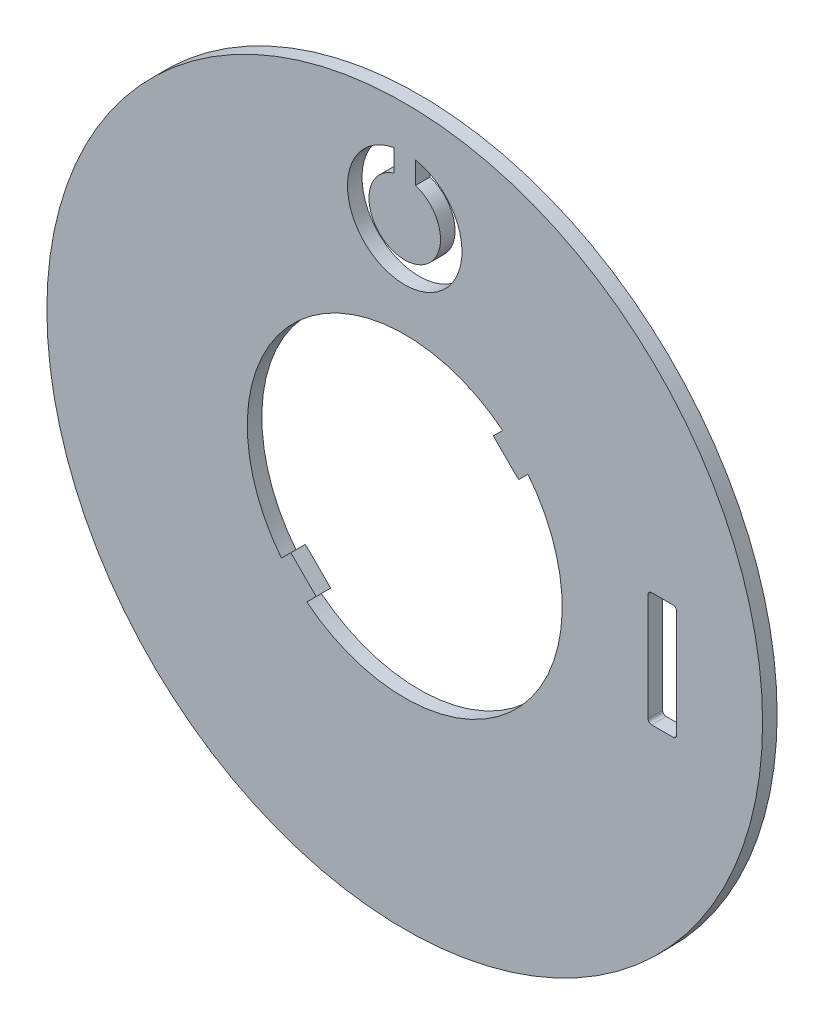
ISO-10303-21;
HEADER;
FILE_DESCRIPTION(('STEP AP214'),'2;1');
FILE_NAME('part.step','',(''),(''),'','','');
FILE_SCHEMA(('AUTOMOTIVE_DESIGN { 1 0 10303 214 1 1 1 1 }'));
ENDSEC;
DATA;
#1=APPLICATION_CONTEXT('core data for automotive mechanical design processes');
#2=APPLICATION_PROTOCOL_DEFINITION('international standard','automotive_design',2000,#1);
#3=PRODUCT_CONTEXT('',#1,'mechanical');
#4=PRODUCT('Part','Part','',(#3));
#5=PRODUCT_RELATED_PRODUCT_CATEGORY('part','',(#4));
#6=PRODUCT_DEFINITION_FORMATION('','',#4);
#7=PRODUCT_DEFINITION_CONTEXT('part definition',#1,'design');
#8=PRODUCT_DEFINITION('design','',#6,#7);
#9=PRODUCT_DEFINITION_SHAPE('','',#8);
#10=(LENGTH_UNIT() NAMED_UNIT(*) SI_UNIT(.MILLI.,.METRE.));
#11=(NAMED_UNIT(*) PLANE_ANGLE_UNIT() SI_UNIT($,.RADIAN.));
#12=(NAMED_UNIT(*) SI_UNIT($,.STERADIAN.) SOLID_ANGLE_UNIT());
#13=UNCERTAINTY_MEASURE_WITH_UNIT(LENGTH_MEASURE(1.E-05),#10,'distance_accuracy_value','');
#14=(GEOMETRIC_REPRESENTATION_CONTEXT(3) GLOBAL_UNCERTAINTY_ASSIGNED_CONTEXT((#13)) GLOBAL_UNIT_ASSIGNED_CONTEXT((#10,
#11,#12)) REPRESENTATION_CONTEXT('',''));
#15=CARTESIAN_POINT('',(0.,0.,0.));
#16=DIRECTION('',(0.,0.,1.));
#17=DIRECTION('',(1.,0.,0.));
#18=AXIS2_PLACEMENT_3D('',#15,#16,#17);
#19=CARTESIAN_POINT('',(107.000000000666,61.8,1.016));
#20=DIRECTION('',(0.,0.,-1.));
#21=DIRECTION('',(-1.,0.,0.));
#22=AXIS2_PLACEMENT_3D('',#19,#20,#21);
#23=CYLINDRICAL_SURFACE('',#22,25.);
#24=CARTESIAN_POINT('',(107.000000000666,61.8,1.016));
#25=DIRECTION('',(0.,0.,1.));
#26=DIRECTION('',(1.,0.,0.));
#27=AXIS2_PLACEMENT_3D('',#24,#25,#26);
#28=CIRCLE('',#27,25.);
#29=CARTESIAN_POINT('',(132.000000000666,61.8,1.016));
#30=VERTEX_POINT('',#29);
#31=EDGE_CURVE('E310',#30,#30,#28,.T.);
#32=ORIENTED_EDGE('',*,*,#31,.F.);
#33=EDGE_LOOP('',(#32));
#34=FACE_BOUND('',#33,.T.);
#35=CARTESIAN_POINT('',(107.000000000666,61.8,0.));
#36=DIRECTION('',(0.,0.,1.));
#37=DIRECTION('',(1.,0.,0.));
#38=AXIS2_PLACEMENT_3D('',#35,#36,#37);
#39=CIRCLE('',#38,25.);
#40=CARTESIAN_POINT('',(132.000000000666,61.8,0.));
#41=VERTEX_POINT('',#40);
#42=EDGE_CURVE('E309',#41,#41,#39,.T.);
#43=ORIENTED_EDGE('',*,*,#42,.T.);
#44=EDGE_LOOP('',(#43));
#45=FACE_BOUND('',#44,.T.);
#46=ADVANCED_FACE('F68',(#34,#45),#23,.T.);
#47=CARTESIAN_POINT('',(107.000000000666,61.8,1.016));
#48=DIRECTION('',(0.,0.,-1.));
#49=DIRECTION('',(-1.,0.,0.));
#50=AXIS2_PLACEMENT_3D('',#47,#48,#49);
#51=CYLINDRICAL_SURFACE('',#50,11.);
#52=CARTESIAN_POINT('',(107.000000000666,61.8,0.));
#53=DIRECTION('',(0.,0.,1.));
#54=DIRECTION('',(1.,0.,0.));
#55=AXIS2_PLACEMENT_3D('',#52,#53,#54);
#56=CIRCLE('',#55,11.);
#57=CARTESIAN_POINT('',(100.156092719112,53.18832576548,0.));
#58=VERTEX_POINT('',#57);
#59=CARTESIAN_POINT('',(115.611674235186,68.6439072815537,0.));
#60=VERTEX_POINT('',#59);
#61=EDGE_CURVE('E317',#58,#60,#56,.T.);
#62=ORIENTED_EDGE('',*,*,#61,.F.);
#63=DIRECTION('',(0.,0.,-1.));
#64=VECTOR('',#63,1.);
#65=CARTESIAN_POINT('',(100.156092719112,53.18832576548,1.016));
#66=LINE('',#65,#64);
#67=CARTESIAN_POINT('',(100.156092719112,53.18832576548,1.016));
#68=VERTEX_POINT('',#67);
#69=EDGE_CURVE('E322',#68,#58,#66,.T.);
#70=ORIENTED_EDGE('',*,*,#69,.F.);
#71=CARTESIAN_POINT('',(107.000000000666,61.8,1.016));
#72=DIRECTION('',(0.,0.,1.));
#73=DIRECTION('',(1.,0.,0.));
#74=AXIS2_PLACEMENT_3D('',#71,#72,#73);
#75=CIRCLE('',#74,11.);
#76=CARTESIAN_POINT('',(115.611674235186,68.6439072815537,1.016));
#77=VERTEX_POINT('',#76);
#78=EDGE_CURVE('E308',#68,#77,#75,.T.);
#79=ORIENTED_EDGE('',*,*,#78,.T.);
#80=DIRECTION('',(0.,0.,-1.));
#81=VECTOR('',#80,1.);
#82=CARTESIAN_POINT('',(115.611674235186,68.6439072815537,1.016));
#83=LINE('',#82,#81);
#84=EDGE_CURVE('E77',#77,#60,#83,.T.);
#85=ORIENTED_EDGE('',*,*,#84,.T.);
#86=EDGE_LOOP('',(#62,#70,#79,#85));
#87=FACE_BOUND('',#86,.T.);
#88=ADVANCED_FACE('F400',(#87),#51,.F.);
#89=CARTESIAN_POINT('',(113.84390728222,70.41167423452,0.));
#90=VERTEX_POINT('',#89);
#91=CARTESIAN_POINT('',(98.3883257661459,54.9560927184463,0.));
#92=VERTEX_POINT('',#91);
#93=EDGE_CURVE('E314',#90,#92,#56,.T.);
#94=ORIENTED_EDGE('',*,*,#93,.F.);
#95=DIRECTION('',(0.,0.,-1.));
#96=VECTOR('',#95,1.);
#97=CARTESIAN_POINT('',(113.84390728222,70.41167423452,1.016));
#98=LINE('',#97,#96);
#99=CARTESIAN_POINT('',(113.84390728222,70.41167423452,1.016));
#100=VERTEX_POINT('',#99);
#101=EDGE_CURVE('E12',#100,#90,#98,.T.);
#102=ORIENTED_EDGE('',*,*,#101,.F.);
#103=CARTESIAN_POINT('',(98.3883257661459,54.9560927184463,1.016));
#104=VERTEX_POINT('',#103);
#105=EDGE_CURVE('E305',#100,#104,#75,.T.);
#106=ORIENTED_EDGE('',*,*,#105,.T.);
#107=DIRECTION('',(0.,0.,-1.));
#108=VECTOR('',#107,1.);
#109=CARTESIAN_POINT('',(98.3883257661459,54.9560927184463,1.016));
#110=LINE('',#109,#108);
#111=EDGE_CURVE('E313',#104,#92,#110,.T.);
#112=ORIENTED_EDGE('',*,*,#111,.T.);
#113=EDGE_LOOP('',(#94,#102,#106,#112));
#114=FACE_BOUND('',#113,.T.);
#115=ADVANCED_FACE('F384',(#114),#51,.F.);
#116=CARTESIAN_POINT('',(0.,0.,0.));
#117=DIRECTION('',(0.,0.,1.));
#118=DIRECTION('',(1.,0.,0.));
#119=AXIS2_PLACEMENT_3D('',#116,#117,#118);
#120=PLANE('',#119);
#121=DIRECTION('',(0.,-1.,0.));
#122=VECTOR('',#121,1.);
#123=CARTESIAN_POINT('',(107.750000000666,0.,0.));
#124=LINE('',#123,#122);
#125=CARTESIAN_POINT('',(107.750000000666,83.7290584113754,0.));
#126=VERTEX_POINT('',#125);
#127=CARTESIAN_POINT('',(107.750000000666,82.1848480035423,0.));
#128=VERTEX_POINT('',#127);
#129=EDGE_CURVE('E223',#126,#128,#124,.T.);
#130=ORIENTED_EDGE('',*,*,#129,.T.);
#131=CARTESIAN_POINT('',(107.000000000666,79.8,0.));
#132=DIRECTION('',(0.,0.,1.));
#133=DIRECTION('',(1.,0.,0.));
#134=AXIS2_PLACEMENT_3D('',#131,#132,#133);
#135=CIRCLE('',#134,2.49999999999996);
#136=CARTESIAN_POINT('',(106.250000000666,82.1848480035423,0.));
#137=VERTEX_POINT('',#136);
#138=EDGE_CURVE('E85',#137,#128,#135,.T.);
#139=ORIENTED_EDGE('',*,*,#138,.F.);
#140=DIRECTION('',(0.,1.,0.));
#141=VECTOR('',#140,1.);
#142=CARTESIAN_POINT('',(106.250000000666,0.,0.));
#143=LINE('',#142,#141);
#144=CARTESIAN_POINT('',(106.250000000666,83.7290584113754,0.));
#145=VERTEX_POINT('',#144);
#146=EDGE_CURVE('E213',#137,#145,#143,.T.);
#147=ORIENTED_EDGE('',*,*,#146,.T.);
#148=CARTESIAN_POINT('',(107.000000000666,79.8,0.));
#149=DIRECTION('',(0.,0.,1.));
#150=DIRECTION('',(1.,0.,0.));
#151=AXIS2_PLACEMENT_3D('',#148,#149,#150);
#152=CIRCLE('',#151,3.99999999999996);
#153=EDGE_CURVE('E238',#145,#126,#152,.T.);
#154=ORIENTED_EDGE('',*,*,#153,.T.);
#155=EDGE_LOOP('',(#130,#139,#147,#154));
#156=FACE_BOUND('',#155,.T.);
#157=DIRECTION('',(1.,0.,0.));
#158=VECTOR('',#157,1.);
#159=CARTESIAN_POINT('',(0.,65.8,0.));
#160=LINE('',#159,#158);
#161=CARTESIAN_POINT('',(124.250000000666,65.8,0.));
#162=VERTEX_POINT('',#161);
#163=CARTESIAN_POINT('',(125.750000000666,65.8,0.));
#164=VERTEX_POINT('',#163);
#165=EDGE_CURVE('E251',#162,#164,#160,.T.);
#166=ORIENTED_EDGE('',*,*,#165,.F.);
#167=CARTESIAN_POINT('',(124.250000000666,65.55,0.));
#168=DIRECTION('',(0.,0.,1.));
#169=DIRECTION('',(1.,0.,0.));
#170=AXIS2_PLACEMENT_3D('',#167,#168,#169);
#171=CIRCLE('',#170,0.25);
#172=CARTESIAN_POINT('',(124.000000000666,65.55,0.));
#173=VERTEX_POINT('',#172);
#174=EDGE_CURVE('E93',#173,#162,#171,.F.);
#175=ORIENTED_EDGE('',*,*,#174,.F.);
#176=DIRECTION('',(0.,1.,0.));
#177=VECTOR('',#176,1.);
#178=CARTESIAN_POINT('',(124.000000000666,0.,0.));
#179=LINE('',#178,#177);
#180=CARTESIAN_POINT('',(124.000000000666,58.05,0.));
#181=VERTEX_POINT('',#180);
#182=EDGE_CURVE('E271',#181,#173,#179,.T.);
#183=ORIENTED_EDGE('',*,*,#182,.F.);
#184=CARTESIAN_POINT('',(124.250000000666,58.05,0.));
#185=DIRECTION('',(0.,0.,1.));
#186=DIRECTION('',(1.,0.,0.));
#187=AXIS2_PLACEMENT_3D('',#184,#185,#186);
#188=CIRCLE('',#187,0.25);
#189=CARTESIAN_POINT('',(124.250000000666,57.8,0.));
#190=VERTEX_POINT('',#189);
#191=EDGE_CURVE('E274',#190,#181,#188,.F.);
#192=ORIENTED_EDGE('',*,*,#191,.F.);
#193=DIRECTION('',(1.,0.,0.));
#194=VECTOR('',#193,1.);
#195=CARTESIAN_POINT('',(0.,57.8,0.));
#196=LINE('',#195,#194);
#197=CARTESIAN_POINT('',(125.750000000666,57.8,0.));
#198=VERTEX_POINT('',#197);
#199=EDGE_CURVE('E277',#190,#198,#196,.T.);
#200=ORIENTED_EDGE('',*,*,#199,.T.);
#201=CARTESIAN_POINT('',(125.750000000666,58.05,0.));
#202=DIRECTION('',(0.,0.,1.));
#203=DIRECTION('',(1.,0.,0.));
#204=AXIS2_PLACEMENT_3D('',#201,#202,#203);
#205=CIRCLE('',#204,0.250000000000014);
#206=CARTESIAN_POINT('',(126.000000000666,58.05,0.));
#207=VERTEX_POINT('',#206);
#208=EDGE_CURVE('E280',#198,#207,#205,.T.);
#209=ORIENTED_EDGE('',*,*,#208,.T.);
#210=DIRECTION('',(0.,1.,0.));
#211=VECTOR('',#210,1.);
#212=CARTESIAN_POINT('',(126.000000000666,0.,0.));
#213=LINE('',#212,#211);
#214=CARTESIAN_POINT('',(126.000000000666,65.55,0.));
#215=VERTEX_POINT('',#214);
#216=EDGE_CURVE('E283',#207,#215,#213,.T.);
#217=ORIENTED_EDGE('',*,*,#216,.T.);
#218=CARTESIAN_POINT('',(125.750000000666,65.55,0.));
#219=DIRECTION('',(0.,0.,1.));
#220=DIRECTION('',(1.,0.,0.));
#221=AXIS2_PLACEMENT_3D('',#218,#219,#220);
#222=CIRCLE('',#221,0.250000000000014);
#223=EDGE_CURVE('E286',#164,#215,#222,.F.);
#224=ORIENTED_EDGE('',*,*,#223,.F.);
#225=EDGE_LOOP('',(#166,#175,#183,#192,#200,#209,#217,#224));
#226=FACE_BOUND('',#225,.T.);
#227=DIRECTION('',(-0.707106781186547,-0.707106781186547,0.));
#228=VECTOR('',#227,1.);
#229=CARTESIAN_POINT('',(113.894291117235,70.4620580695352,0.));
#230=LINE('',#229,#228);
#231=CARTESIAN_POINT('',(113.187184336048,69.7549512883487,0.));
#232=VERTEX_POINT('',#231);
#233=EDGE_CURVE('E337',#90,#232,#230,.T.);
#234=ORIENTED_EDGE('',*,*,#233,.F.);
#235=ORIENTED_EDGE('',*,*,#93,.T.);
#236=DIRECTION('',(-0.707106781186534,-0.707106781186561,0.));
#237=VECTOR('',#236,1.);
#238=CARTESIAN_POINT('',(99.0450487123172,55.6128156646177,0.));
#239=LINE('',#238,#237);
#240=CARTESIAN_POINT('',(99.0450487123172,55.6128156646177,0.));
#241=VERTEX_POINT('',#240);
#242=EDGE_CURVE('E347',#241,#92,#239,.T.);
#243=ORIENTED_EDGE('',*,*,#242,.F.);
#244=DIRECTION('',(-0.707106781186549,0.707106781186546,0.));
#245=VECTOR('',#244,1.);
#246=CARTESIAN_POINT('',(100.812815665284,53.8450487116514,0.));
#247=LINE('',#246,#245);
#248=CARTESIAN_POINT('',(100.812815665284,53.8450487116514,0.));
#249=VERTEX_POINT('',#248);
#250=EDGE_CURVE('E354',#249,#241,#247,.T.);
#251=ORIENTED_EDGE('',*,*,#250,.F.);
#252=DIRECTION('',(0.707106781186547,0.707106781186547,0.));
#253=VECTOR('',#252,1.);
#254=CARTESIAN_POINT('',(100.105708884097,53.1379419304648,0.));
#255=LINE('',#254,#253);
#256=EDGE_CURVE('E214',#58,#249,#255,.T.);
#257=ORIENTED_EDGE('',*,*,#256,.F.);
#258=ORIENTED_EDGE('',*,*,#61,.T.);
#259=DIRECTION('',(0.707106781186547,0.707106781186547,0.));
#260=VECTOR('',#259,1.);
#261=CARTESIAN_POINT('',(114.954951289015,67.9871843353823,0.));
#262=LINE('',#261,#260);
#263=CARTESIAN_POINT('',(114.954951289015,67.9871843353823,0.));
#264=VERTEX_POINT('',#263);
#265=EDGE_CURVE('E334',#264,#60,#262,.T.);
#266=ORIENTED_EDGE('',*,*,#265,.F.);
#267=DIRECTION('',(0.707106781186547,-0.707106781186547,0.));
#268=VECTOR('',#267,1.);
#269=CARTESIAN_POINT('',(113.187184336048,69.7549512883487,0.));
#270=LINE('',#269,#268);
#271=EDGE_CURVE('E329',#232,#264,#270,.T.);
#272=ORIENTED_EDGE('',*,*,#271,.F.);
#273=EDGE_LOOP('',(#234,#235,#243,#251,#257,#258,#266,#272));
#274=FACE_BOUND('',#273,.T.);
#275=ORIENTED_EDGE('',*,*,#42,.F.);
#276=EDGE_LOOP('',(#275));
#277=FACE_BOUND('',#276,.T.);
#278=ADVANCED_FACE('F376',(#156,#226,#274,#277),#120,.F.);
#279=CARTESIAN_POINT('',(0.,0.,1.016));
#280=DIRECTION('',(0.,0.,1.));
#281=DIRECTION('',(1.,0.,0.));
#282=AXIS2_PLACEMENT_3D('',#279,#280,#281);
#283=PLANE('',#282);
#284=CARTESIAN_POINT('',(107.000000000666,79.8,1.016));
#285=DIRECTION('',(0.,0.,1.));
#286=DIRECTION('',(1.,0.,0.));
#287=AXIS2_PLACEMENT_3D('',#284,#285,#286);
#288=CIRCLE('',#287,2.49999999999996);
#289=CARTESIAN_POINT('',(106.250000000666,82.1848480035423,1.016));
#290=VERTEX_POINT('',#289);
#291=CARTESIAN_POINT('',(107.750000000666,82.1848480035423,1.016));
#292=VERTEX_POINT('',#291);
#293=EDGE_CURVE('E218',#290,#292,#288,.T.);
#294=ORIENTED_EDGE('',*,*,#293,.T.);
#295=DIRECTION('',(0.,-1.,0.));
#296=VECTOR('',#295,1.);
#297=CARTESIAN_POINT('',(107.750000000666,0.,1.016));
#298=LINE('',#297,#296);
#299=CARTESIAN_POINT('',(107.750000000666,83.7290584113754,1.016));
#300=VERTEX_POINT('',#299);
#301=EDGE_CURVE('E231',#300,#292,#298,.T.);
#302=ORIENTED_EDGE('',*,*,#301,.F.);
#303=CARTESIAN_POINT('',(107.000000000666,79.8,1.016));
#304=DIRECTION('',(0.,0.,1.));
#305=DIRECTION('',(1.,0.,0.));
#306=AXIS2_PLACEMENT_3D('',#303,#304,#305);
#307=CIRCLE('',#306,3.99999999999996);
#308=CARTESIAN_POINT('',(106.250000000666,83.7290584113754,1.016));
#309=VERTEX_POINT('',#308);
#310=EDGE_CURVE('E229',#309,#300,#307,.T.);
#311=ORIENTED_EDGE('',*,*,#310,.F.);
#312=DIRECTION('',(0.,1.,0.));
#313=VECTOR('',#312,1.);
#314=CARTESIAN_POINT('',(106.250000000666,0.,1.016));
#315=LINE('',#314,#313);
#316=EDGE_CURVE('E210',#290,#309,#315,.T.);
#317=ORIENTED_EDGE('',*,*,#316,.F.);
#318=EDGE_LOOP('',(#294,#302,#311,#317));
#319=FACE_BOUND('',#318,.T.);
#320=CARTESIAN_POINT('',(124.250000000666,65.55,1.016));
#321=DIRECTION('',(0.,0.,1.));
#322=DIRECTION('',(1.,0.,0.));
#323=AXIS2_PLACEMENT_3D('',#320,#321,#322);
#324=CIRCLE('',#323,0.25);
#325=CARTESIAN_POINT('',(124.000000000666,65.55,1.016));
#326=VERTEX_POINT('',#325);
#327=CARTESIAN_POINT('',(124.250000000666,65.8,1.016));
#328=VERTEX_POINT('',#327);
#329=EDGE_CURVE('E247',#326,#328,#324,.F.);
#330=ORIENTED_EDGE('',*,*,#329,.T.);
#331=DIRECTION('',(1.,0.,0.));
#332=VECTOR('',#331,1.);
#333=CARTESIAN_POINT('',(0.,65.8,1.016));
#334=LINE('',#333,#332);
#335=CARTESIAN_POINT('',(125.750000000666,65.8,1.016));
#336=VERTEX_POINT('',#335);
#337=EDGE_CURVE('E266',#328,#336,#334,.T.);
#338=ORIENTED_EDGE('',*,*,#337,.T.);
#339=CARTESIAN_POINT('',(125.750000000666,65.55,1.016));
#340=DIRECTION('',(0.,0.,1.));
#341=DIRECTION('',(1.,0.,0.));
#342=AXIS2_PLACEMENT_3D('',#339,#340,#341);
#343=CIRCLE('',#342,0.250000000000014);
#344=CARTESIAN_POINT('',(126.000000000666,65.55,1.016));
#345=VERTEX_POINT('',#344);
#346=EDGE_CURVE('E263',#336,#345,#343,.F.);
#347=ORIENTED_EDGE('',*,*,#346,.T.);
#348=DIRECTION('',(0.,1.,0.));
#349=VECTOR('',#348,1.);
#350=CARTESIAN_POINT('',(126.000000000666,0.,1.016));
#351=LINE('',#350,#349);
#352=CARTESIAN_POINT('',(126.000000000666,58.05,1.016));
#353=VERTEX_POINT('',#352);
#354=EDGE_CURVE('E261',#353,#345,#351,.T.);
#355=ORIENTED_EDGE('',*,*,#354,.F.);
#356=CARTESIAN_POINT('',(125.750000000666,58.05,1.016));
#357=DIRECTION('',(0.,0.,1.));
#358=DIRECTION('',(1.,0.,0.));
#359=AXIS2_PLACEMENT_3D('',#356,#357,#358);
#360=CIRCLE('',#359,0.250000000000014);
#361=CARTESIAN_POINT('',(125.750000000666,57.8,1.016));
#362=VERTEX_POINT('',#361);
#363=EDGE_CURVE('E259',#362,#353,#360,.T.);
#364=ORIENTED_EDGE('',*,*,#363,.F.);
#365=DIRECTION('',(1.,0.,0.));
#366=VECTOR('',#365,1.);
#367=CARTESIAN_POINT('',(0.,57.8,1.016));
#368=LINE('',#367,#366);
#369=CARTESIAN_POINT('',(124.250000000666,57.8,1.016));
#370=VERTEX_POINT('',#369);
#371=EDGE_CURVE('E257',#370,#362,#368,.T.);
#372=ORIENTED_EDGE('',*,*,#371,.F.);
#373=CARTESIAN_POINT('',(124.250000000666,58.05,1.016));
#374=DIRECTION('',(0.,0.,1.));
#375=DIRECTION('',(1.,0.,0.));
#376=AXIS2_PLACEMENT_3D('',#373,#374,#375);
#377=CIRCLE('',#376,0.25);
#378=CARTESIAN_POINT('',(124.000000000666,58.05,1.016));
#379=VERTEX_POINT('',#378);
#380=EDGE_CURVE('E254',#370,#379,#377,.F.);
#381=ORIENTED_EDGE('',*,*,#380,.T.);
#382=DIRECTION('',(0.,1.,0.));
#383=VECTOR('',#382,1.);
#384=CARTESIAN_POINT('',(124.000000000666,0.,1.016));
#385=LINE('',#384,#383);
#386=EDGE_CURVE('E250',#379,#326,#385,.T.);
#387=ORIENTED_EDGE('',*,*,#386,.T.);
#388=EDGE_LOOP('',(#330,#338,#347,#355,#364,#372,#381,#387));
#389=FACE_BOUND('',#388,.T.);
#390=ORIENTED_EDGE('',*,*,#105,.F.);
#391=DIRECTION('',(-0.707106781186547,-0.707106781186547,0.));
#392=VECTOR('',#391,1.);
#393=CARTESIAN_POINT('',(113.894291117235,70.4620580695352,1.016));
#394=LINE('',#393,#392);
#395=CARTESIAN_POINT('',(113.187184336048,69.7549512883487,1.016));
#396=VERTEX_POINT('',#395);
#397=EDGE_CURVE('E328',#100,#396,#394,.T.);
#398=ORIENTED_EDGE('',*,*,#397,.T.);
#399=DIRECTION('',(0.707106781186547,-0.707106781186547,0.));
#400=VECTOR('',#399,1.);
#401=CARTESIAN_POINT('',(113.187184336048,69.7549512883487,1.016));
#402=LINE('',#401,#400);
#403=CARTESIAN_POINT('',(114.954951289015,67.9871843353823,1.016));
#404=VERTEX_POINT('',#403);
#405=EDGE_CURVE('E331',#396,#404,#402,.T.);
#406=ORIENTED_EDGE('',*,*,#405,.T.);
#407=DIRECTION('',(0.707106781186547,0.707106781186547,0.));
#408=VECTOR('',#407,1.);
#409=CARTESIAN_POINT('',(114.954951289015,67.9871843353823,1.016));
#410=LINE('',#409,#408);
#411=EDGE_CURVE('E325',#404,#77,#410,.T.);
#412=ORIENTED_EDGE('',*,*,#411,.T.);
#413=ORIENTED_EDGE('',*,*,#78,.F.);
#414=DIRECTION('',(0.707106781186547,0.707106781186547,0.));
#415=VECTOR('',#414,1.);
#416=CARTESIAN_POINT('',(100.105708884097,53.1379419304648,1.016));
#417=LINE('',#416,#415);
#418=CARTESIAN_POINT('',(100.812815665284,53.8450487116514,1.016));
#419=VERTEX_POINT('',#418);
#420=EDGE_CURVE('E344',#68,#419,#417,.T.);
#421=ORIENTED_EDGE('',*,*,#420,.T.);
#422=DIRECTION('',(-0.707106781186549,0.707106781186546,0.));
#423=VECTOR('',#422,1.);
#424=CARTESIAN_POINT('',(100.812815665284,53.8450487116514,1.016));
#425=LINE('',#424,#423);
#426=CARTESIAN_POINT('',(99.0450487123172,55.6128156646177,1.016));
#427=VERTEX_POINT('',#426);
#428=EDGE_CURVE('E346',#419,#427,#425,.T.);
#429=ORIENTED_EDGE('',*,*,#428,.T.);
#430=DIRECTION('',(-0.707106781186534,-0.707106781186561,0.));
#431=VECTOR('',#430,1.);
#432=CARTESIAN_POINT('',(99.0450487123172,55.6128156646177,1.016));
#433=LINE('',#432,#431);
#434=EDGE_CURVE('E349',#427,#104,#433,.T.);
#435=ORIENTED_EDGE('',*,*,#434,.T.);
#436=EDGE_LOOP('',(#390,#398,#406,#412,#413,#421,#429,#435));
#437=FACE_BOUND('',#436,.T.);
#438=ORIENTED_EDGE('',*,*,#31,.T.);
#439=EDGE_LOOP('',(#438));
#440=FACE_BOUND('',#439,.T.);
#441=ADVANCED_FACE('F226',(#319,#389,#437,#440),#283,.T.);
#442=CARTESIAN_POINT('',(100.105708884097,53.1379419304648,1.016));
#443=DIRECTION('',(-0.707106781186548,0.707106781186548,0.));
#444=DIRECTION('',(-0.707106781186548,-0.707106781186548,0.));
#445=AXIS2_PLACEMENT_3D('',#442,#443,#444);
#446=PLANE('',#445);
#447=ORIENTED_EDGE('',*,*,#420,.F.);
#448=ORIENTED_EDGE('',*,*,#69,.T.);
#449=ORIENTED_EDGE('',*,*,#256,.T.);
#450=DIRECTION('',(0.,0.,-1.));
#451=VECTOR('',#450,1.);
#452=CARTESIAN_POINT('',(100.812815665284,53.8450487116514,1.016));
#453=LINE('',#452,#451);
#454=EDGE_CURVE('E72',#419,#249,#453,.T.);
#455=ORIENTED_EDGE('',*,*,#454,.F.);
#456=EDGE_LOOP('',(#447,#448,#449,#455));
#457=FACE_BOUND('',#456,.T.);
#458=ADVANCED_FACE('F70',(#457),#446,.F.);
#459=CARTESIAN_POINT('',(100.812815665284,53.8450487116514,1.016));
#460=DIRECTION('',(-0.707106781186546,-0.707106781186549,0.));
#461=DIRECTION('',(0.707106781186549,-0.707106781186546,0.));
#462=AXIS2_PLACEMENT_3D('',#459,#460,#461);
#463=PLANE('',#462);
#464=ORIENTED_EDGE('',*,*,#250,.T.);
#465=DIRECTION('',(0.,0.,-1.));
#466=VECTOR('',#465,1.);
#467=CARTESIAN_POINT('',(99.0450487123172,55.6128156646177,1.016));
#468=LINE('',#467,#466);
#469=EDGE_CURVE('E352',#427,#241,#468,.T.);
#470=ORIENTED_EDGE('',*,*,#469,.F.);
#471=ORIENTED_EDGE('',*,*,#428,.F.);
#472=ORIENTED_EDGE('',*,*,#454,.T.);
#473=EDGE_LOOP('',(#464,#470,#471,#472));
#474=FACE_BOUND('',#473,.T.);
#475=ADVANCED_FACE('F366',(#474),#463,.F.);
#476=CARTESIAN_POINT('',(99.0450487123172,55.6128156646177,1.016));
#477=DIRECTION('',(0.707106781186561,-0.707106781186534,0.));
#478=DIRECTION('',(0.707106781186534,0.707106781186561,0.));
#479=AXIS2_PLACEMENT_3D('',#476,#477,#478);
#480=PLANE('',#479);
#481=ORIENTED_EDGE('',*,*,#111,.F.);
#482=ORIENTED_EDGE('',*,*,#434,.F.);
#483=ORIENTED_EDGE('',*,*,#469,.T.);
#484=ORIENTED_EDGE('',*,*,#242,.T.);
#485=EDGE_LOOP('',(#481,#482,#483,#484));
#486=FACE_BOUND('',#485,.T.);
#487=ADVANCED_FACE('F379',(#486),#480,.F.);
#488=CARTESIAN_POINT('',(113.894291117235,70.4620580695352,1.016));
#489=DIRECTION('',(0.707106781186548,-0.707106781186548,0.));
#490=DIRECTION('',(0.707106781186548,0.707106781186548,0.));
#491=AXIS2_PLACEMENT_3D('',#488,#489,#490);
#492=PLANE('',#491);
#493=ORIENTED_EDGE('',*,*,#397,.F.);
#494=ORIENTED_EDGE('',*,*,#101,.T.);
#495=ORIENTED_EDGE('',*,*,#233,.T.);
#496=DIRECTION('',(0.,0.,-1.));
#497=VECTOR('',#496,1.);
#498=CARTESIAN_POINT('',(113.187184336048,69.7549512883487,1.016));
#499=LINE('',#498,#497);
#500=EDGE_CURVE('E318',#396,#232,#499,.T.);
#501=ORIENTED_EDGE('',*,*,#500,.F.);
#502=EDGE_LOOP('',(#493,#494,#495,#501));
#503=FACE_BOUND('',#502,.T.);
#504=ADVANCED_FACE('F388',(#503),#492,.F.);
#505=CARTESIAN_POINT('',(113.187184336048,69.7549512883487,1.016));
#506=DIRECTION('',(0.707106781186548,0.707106781186548,0.));
#507=DIRECTION('',(-0.707106781186548,0.707106781186548,0.));
#508=AXIS2_PLACEMENT_3D('',#505,#506,#507);
#509=PLANE('',#508);
#510=ORIENTED_EDGE('',*,*,#271,.T.);
#511=DIRECTION('',(0.,0.,-1.));
#512=VECTOR('',#511,1.);
#513=CARTESIAN_POINT('',(114.954951289015,67.9871843353823,1.016));
#514=LINE('',#513,#512);
#515=EDGE_CURVE('E333',#404,#264,#514,.T.);
#516=ORIENTED_EDGE('',*,*,#515,.F.);
#517=ORIENTED_EDGE('',*,*,#405,.F.);
#518=ORIENTED_EDGE('',*,*,#500,.T.);
#519=EDGE_LOOP('',(#510,#516,#517,#518));
#520=FACE_BOUND('',#519,.T.);
#521=ADVANCED_FACE('F394',(#520),#509,.F.);
#522=CARTESIAN_POINT('',(114.954951289015,67.9871843353823,1.016));
#523=DIRECTION('',(-0.707106781186548,0.707106781186548,0.));
#524=DIRECTION('',(-0.707106781186548,-0.707106781186548,0.));
#525=AXIS2_PLACEMENT_3D('',#522,#523,#524);
#526=PLANE('',#525);
#527=ORIENTED_EDGE('',*,*,#84,.F.);
#528=ORIENTED_EDGE('',*,*,#411,.F.);
#529=ORIENTED_EDGE('',*,*,#515,.T.);
#530=ORIENTED_EDGE('',*,*,#265,.T.);
#531=EDGE_LOOP('',(#527,#528,#529,#530));
#532=FACE_BOUND('',#531,.T.);
#533=ADVANCED_FACE('F398',(#532),#526,.F.);
#534=CARTESIAN_POINT('',(124.250000000666,65.55,1.016));
#535=DIRECTION('',(0.,0.,-1.));
#536=DIRECTION('',(-1.,0.,0.));
#537=AXIS2_PLACEMENT_3D('',#534,#535,#536);
#538=CYLINDRICAL_SURFACE('',#537,0.25);
#539=ORIENTED_EDGE('',*,*,#174,.T.);
#540=DIRECTION('',(0.,0.,-1.));
#541=VECTOR('',#540,1.);
#542=CARTESIAN_POINT('',(124.250000000666,65.8,1.016));
#543=LINE('',#542,#541);
#544=EDGE_CURVE('E269',#328,#162,#543,.T.);
#545=ORIENTED_EDGE('',*,*,#544,.F.);
#546=ORIENTED_EDGE('',*,*,#329,.F.);
#547=DIRECTION('',(0.,0.,-1.));
#548=VECTOR('',#547,1.);
#549=CARTESIAN_POINT('',(124.000000000666,65.55,1.016));
#550=LINE('',#549,#548);
#551=EDGE_CURVE('E236',#326,#173,#550,.T.);
#552=ORIENTED_EDGE('',*,*,#551,.T.);
#553=EDGE_LOOP('',(#539,#545,#546,#552));
#554=FACE_BOUND('',#553,.T.);
#555=ADVANCED_FACE('F417',(#554),#538,.F.);
#556=CARTESIAN_POINT('',(124.000000000666,0.,1.016));
#557=DIRECTION('',(-1.,0.,0.));
#558=DIRECTION('',(0.,0.,1.));
#559=AXIS2_PLACEMENT_3D('',#556,#557,#558);
#560=PLANE('',#559);
#561=ORIENTED_EDGE('',*,*,#182,.T.);
#562=ORIENTED_EDGE('',*,*,#551,.F.);
#563=ORIENTED_EDGE('',*,*,#386,.F.);
#564=DIRECTION('',(0.,0.,-1.));
#565=VECTOR('',#564,1.);
#566=CARTESIAN_POINT('',(124.000000000666,58.05,1.016));
#567=LINE('',#566,#565);
#568=EDGE_CURVE('E302',#379,#181,#567,.T.);
#569=ORIENTED_EDGE('',*,*,#568,.T.);
#570=EDGE_LOOP('',(#561,#562,#563,#569));
#571=FACE_BOUND('',#570,.T.);
#572=ADVANCED_FACE('F434',(#571),#560,.F.);
#573=CARTESIAN_POINT('',(124.250000000666,58.05,1.016));
#574=DIRECTION('',(0.,0.,-1.));
#575=DIRECTION('',(-1.,0.,0.));
#576=AXIS2_PLACEMENT_3D('',#573,#574,#575);
#577=CYLINDRICAL_SURFACE('',#576,0.25);
#578=ORIENTED_EDGE('',*,*,#191,.T.);
#579=ORIENTED_EDGE('',*,*,#568,.F.);
#580=ORIENTED_EDGE('',*,*,#380,.F.);
#581=DIRECTION('',(0.,0.,-1.));
#582=VECTOR('',#581,1.);
#583=CARTESIAN_POINT('',(124.250000000666,57.8,1.016));
#584=LINE('',#583,#582);
#585=EDGE_CURVE('E300',#370,#190,#584,.T.);
#586=ORIENTED_EDGE('',*,*,#585,.T.);
#587=EDGE_LOOP('',(#578,#579,#580,#586));
#588=FACE_BOUND('',#587,.T.);
#589=ADVANCED_FACE('F437',(#588),#577,.F.);
#590=CARTESIAN_POINT('',(0.,57.8,1.016));
#591=DIRECTION('',(0.,1.,0.));
#592=DIRECTION('',(0.,0.,1.));
#593=AXIS2_PLACEMENT_3D('',#590,#591,#592);
#594=PLANE('',#593);
#595=ORIENTED_EDGE('',*,*,#199,.F.);
#596=ORIENTED_EDGE('',*,*,#585,.F.);
#597=ORIENTED_EDGE('',*,*,#371,.T.);
#598=DIRECTION('',(0.,0.,-1.));
#599=VECTOR('',#598,1.);
#600=CARTESIAN_POINT('',(125.750000000666,57.8,1.016));
#601=LINE('',#600,#599);
#602=EDGE_CURVE('E298',#362,#198,#601,.T.);
#603=ORIENTED_EDGE('',*,*,#602,.T.);
#604=EDGE_LOOP('',(#595,#596,#597,#603));
#605=FACE_BOUND('',#604,.T.);
#606=ADVANCED_FACE('F441',(#605),#594,.T.);
#607=CARTESIAN_POINT('',(125.750000000666,58.05,1.016));
#608=DIRECTION('',(0.,0.,-1.));
#609=DIRECTION('',(-1.,0.,0.));
#610=AXIS2_PLACEMENT_3D('',#607,#608,#609);
#611=CYLINDRICAL_SURFACE('',#610,0.250000000000014);
#612=ORIENTED_EDGE('',*,*,#208,.F.);
#613=ORIENTED_EDGE('',*,*,#602,.F.);
#614=ORIENTED_EDGE('',*,*,#363,.T.);
#615=DIRECTION('',(0.,0.,-1.));
#616=VECTOR('',#615,1.);
#617=CARTESIAN_POINT('',(126.000000000666,58.05,1.016));
#618=LINE('',#617,#616);
#619=EDGE_CURVE('E296',#353,#207,#618,.T.);
#620=ORIENTED_EDGE('',*,*,#619,.T.);
#621=EDGE_LOOP('',(#612,#613,#614,#620));
#622=FACE_BOUND('',#621,.T.);
#623=ADVANCED_FACE('F445',(#622),#611,.F.);
#624=CARTESIAN_POINT('',(126.000000000666,0.,1.016));
#625=DIRECTION('',(-1.,0.,0.));
#626=DIRECTION('',(0.,0.,1.));
#627=AXIS2_PLACEMENT_3D('',#624,#625,#626);
#628=PLANE('',#627);
#629=ORIENTED_EDGE('',*,*,#216,.F.);
#630=ORIENTED_EDGE('',*,*,#619,.F.);
#631=ORIENTED_EDGE('',*,*,#354,.T.);
#632=DIRECTION('',(0.,0.,-1.));
#633=VECTOR('',#632,1.);
#634=CARTESIAN_POINT('',(126.000000000666,65.55,1.016));
#635=LINE('',#634,#633);
#636=EDGE_CURVE('E294',#345,#215,#635,.T.);
#637=ORIENTED_EDGE('',*,*,#636,.T.);
#638=EDGE_LOOP('',(#629,#630,#631,#637));
#639=FACE_BOUND('',#638,.T.);
#640=ADVANCED_FACE('F449',(#639),#628,.T.);
#641=CARTESIAN_POINT('',(125.750000000666,65.55,1.016));
#642=DIRECTION('',(0.,0.,-1.));
#643=DIRECTION('',(-1.,0.,0.));
#644=AXIS2_PLACEMENT_3D('',#641,#642,#643);
#645=CYLINDRICAL_SURFACE('',#644,0.250000000000014);
#646=ORIENTED_EDGE('',*,*,#223,.T.);
#647=ORIENTED_EDGE('',*,*,#636,.F.);
#648=ORIENTED_EDGE('',*,*,#346,.F.);
#649=DIRECTION('',(0.,0.,-1.));
#650=VECTOR('',#649,1.);
#651=CARTESIAN_POINT('',(125.750000000666,65.8,1.016));
#652=LINE('',#651,#650);
#653=EDGE_CURVE('E292',#336,#164,#652,.T.);
#654=ORIENTED_EDGE('',*,*,#653,.T.);
#655=EDGE_LOOP('',(#646,#647,#648,#654));
#656=FACE_BOUND('',#655,.T.);
#657=ADVANCED_FACE('F453',(#656),#645,.F.);
#658=CARTESIAN_POINT('',(0.,65.8,1.016));
#659=DIRECTION('',(0.,1.,0.));
#660=DIRECTION('',(0.,0.,1.));
#661=AXIS2_PLACEMENT_3D('',#658,#659,#660);
#662=PLANE('',#661);
#663=ORIENTED_EDGE('',*,*,#165,.T.);
#664=ORIENTED_EDGE('',*,*,#653,.F.);
#665=ORIENTED_EDGE('',*,*,#337,.F.);
#666=ORIENTED_EDGE('',*,*,#544,.T.);
#667=EDGE_LOOP('',(#663,#664,#665,#666));
#668=FACE_BOUND('',#667,.T.);
#669=ADVANCED_FACE('F457',(#668),#662,.F.);
#670=CARTESIAN_POINT('',(107.000000000666,79.8,1.016));
#671=DIRECTION('',(0.,0.,-1.));
#672=DIRECTION('',(-1.,0.,0.));
#673=AXIS2_PLACEMENT_3D('',#670,#671,#672);
#674=CYLINDRICAL_SURFACE('',#673,2.49999999999996);
#675=ORIENTED_EDGE('',*,*,#138,.T.);
#676=DIRECTION('',(0.,0.,-1.));
#677=VECTOR('',#676,1.);
#678=CARTESIAN_POINT('',(107.750000000666,82.1848480035423,1.016));
#679=LINE('',#678,#677);
#680=EDGE_CURVE('E220',#292,#128,#679,.T.);
#681=ORIENTED_EDGE('',*,*,#680,.F.);
#682=ORIENTED_EDGE('',*,*,#293,.F.);
#683=DIRECTION('',(0.,0.,-1.));
#684=VECTOR('',#683,1.);
#685=CARTESIAN_POINT('',(106.250000000666,82.1848480035423,1.016));
#686=LINE('',#685,#684);
#687=EDGE_CURVE('E206',#290,#137,#686,.T.);
#688=ORIENTED_EDGE('',*,*,#687,.T.);
#689=EDGE_LOOP('',(#675,#681,#682,#688));
#690=FACE_BOUND('',#689,.T.);
#691=ADVANCED_FACE('F219',(#690),#674,.T.);
#692=CARTESIAN_POINT('',(106.250000000666,0.,1.016));
#693=DIRECTION('',(-1.,0.,0.));
#694=DIRECTION('',(0.,0.,1.));
#695=AXIS2_PLACEMENT_3D('',#692,#693,#694);
#696=PLANE('',#695);
#697=ORIENTED_EDGE('',*,*,#146,.F.);
#698=ORIENTED_EDGE('',*,*,#687,.F.);
#699=ORIENTED_EDGE('',*,*,#316,.T.);
#700=DIRECTION('',(0.,0.,-1.));
#701=VECTOR('',#700,1.);
#702=CARTESIAN_POINT('',(106.250000000666,83.7290584113754,1.016));
#703=LINE('',#702,#701);
#704=EDGE_CURVE('E215',#309,#145,#703,.T.);
#705=ORIENTED_EDGE('',*,*,#704,.T.);
#706=EDGE_LOOP('',(#697,#698,#699,#705));
#707=FACE_BOUND('',#706,.T.);
#708=ADVANCED_FACE('F208',(#707),#696,.T.);
#709=CARTESIAN_POINT('',(107.000000000666,79.8,1.016));
#710=DIRECTION('',(0.,0.,-1.));
#711=DIRECTION('',(-1.,0.,0.));
#712=AXIS2_PLACEMENT_3D('',#709,#710,#711);
#713=CYLINDRICAL_SURFACE('',#712,3.99999999999996);
#714=ORIENTED_EDGE('',*,*,#153,.F.);
#715=ORIENTED_EDGE('',*,*,#704,.F.);
#716=ORIENTED_EDGE('',*,*,#310,.T.);
#717=DIRECTION('',(0.,0.,-1.));
#718=VECTOR('',#717,1.);
#719=CARTESIAN_POINT('',(107.750000000666,83.7290584113754,1.016));
#720=LINE('',#719,#718);
#721=EDGE_CURVE('E244',#300,#126,#720,.T.);
#722=ORIENTED_EDGE('',*,*,#721,.T.);
#723=EDGE_LOOP('',(#714,#715,#716,#722));
#724=FACE_BOUND('',#723,.T.);
#725=ADVANCED_FACE('F466',(#724),#713,.F.);
#726=CARTESIAN_POINT('',(107.750000000666,0.,1.016));
#727=DIRECTION('',(1.,0.,0.));
#728=DIRECTION('',(0.,0.,-1.));
#729=AXIS2_PLACEMENT_3D('',#726,#727,#728);
#730=PLANE('',#729);
#731=ORIENTED_EDGE('',*,*,#129,.F.);
#732=ORIENTED_EDGE('',*,*,#721,.F.);
#733=ORIENTED_EDGE('',*,*,#301,.T.);
#734=ORIENTED_EDGE('',*,*,#680,.T.);
#735=EDGE_LOOP('',(#731,#732,#733,#734));
#736=FACE_BOUND('',#735,.T.);
#737=ADVANCED_FACE('F469',(#736),#730,.T.);
#738=CLOSED_SHELL('',(#46,#88,#115,#278,#441,#458,#475,#487,#504,#521,#533,#555,#572,#589,#606,
#623,#640,#657,#669,#691,#708,#725,#737));
#739=MANIFOLD_SOLID_BREP('B2',#738);
#740=ADVANCED_BREP_SHAPE_REPRESENTATION('',(#18,#739),#14);
#741=SHAPE_DEFINITION_REPRESENTATION(#9,#740);
ENDSEC;
END-ISO-10303-21;
